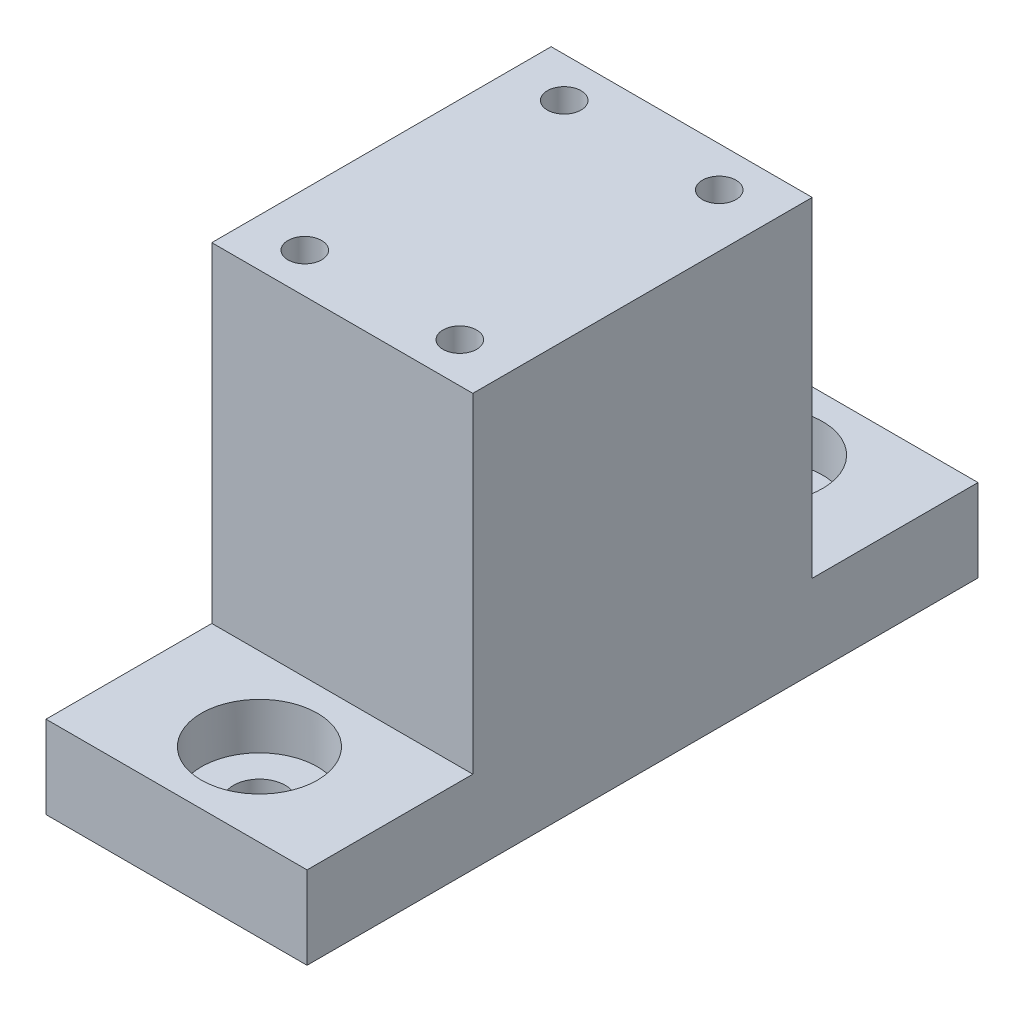
ISO-10303-21;
HEADER;
FILE_DESCRIPTION(('STEP AP214'),'2;1');
FILE_NAME('part.step','',(''),(''),'','','');
FILE_SCHEMA(('AUTOMOTIVE_DESIGN { 1 0 10303 214 1 1 1 1 }'));
ENDSEC;
DATA;
#1=APPLICATION_CONTEXT('core data for automotive mechanical design processes');
#2=APPLICATION_PROTOCOL_DEFINITION('international standard','automotive_design',2000,#1);
#3=PRODUCT_CONTEXT('',#1,'mechanical');
#4=PRODUCT('Part','Part','',(#3));
#5=PRODUCT_RELATED_PRODUCT_CATEGORY('part','',(#4));
#6=PRODUCT_DEFINITION_FORMATION('','',#4);
#7=PRODUCT_DEFINITION_CONTEXT('part definition',#1,'design');
#8=PRODUCT_DEFINITION('design','',#6,#7);
#9=PRODUCT_DEFINITION_SHAPE('','',#8);
#10=(LENGTH_UNIT() NAMED_UNIT(*) SI_UNIT(.MILLI.,.METRE.));
#11=(NAMED_UNIT(*) PLANE_ANGLE_UNIT() SI_UNIT($,.RADIAN.));
#12=(NAMED_UNIT(*) SI_UNIT($,.STERADIAN.) SOLID_ANGLE_UNIT());
#13=UNCERTAINTY_MEASURE_WITH_UNIT(LENGTH_MEASURE(1.E-05),#10,'distance_accuracy_value','');
#14=(GEOMETRIC_REPRESENTATION_CONTEXT(3) GLOBAL_UNCERTAINTY_ASSIGNED_CONTEXT((#13)) GLOBAL_UNIT_ASSIGNED_CONTEXT((#10,
#11,#12)) REPRESENTATION_CONTEXT('',''));
#15=CARTESIAN_POINT('',(0.,0.,0.));
#16=DIRECTION('',(0.,0.,1.));
#17=DIRECTION('',(1.,0.,0.));
#18=AXIS2_PLACEMENT_3D('',#15,#16,#17);
#19=CARTESIAN_POINT('',(19.99996,0.,38.7));
#20=DIRECTION('',(0.,1.,0.));
#21=DIRECTION('',(0.,0.,1.));
#22=AXIS2_PLACEMENT_3D('',#19,#20,#21);
#23=CYLINDRICAL_SURFACE('',#22,3.96875000000001);
#24=CARTESIAN_POINT('',(19.99996,0.,38.7));
#25=DIRECTION('',(0.,-1.,0.));
#26=DIRECTION('',(0.,0.,-1.));
#27=AXIS2_PLACEMENT_3D('',#24,#25,#26);
#28=CIRCLE('',#27,3.96875000000001);
#29=CARTESIAN_POINT('',(19.99996,0.,34.73125));
#30=VERTEX_POINT('',#29);
#31=EDGE_CURVE('E235',#30,#30,#28,.T.);
#32=ORIENTED_EDGE('',*,*,#31,.T.);
#33=EDGE_LOOP('',(#32));
#34=FACE_BOUND('',#33,.T.);
#35=CARTESIAN_POINT('',(19.99996,5.55751999999998,38.7));
#36=DIRECTION('',(0.,1.,0.));
#37=DIRECTION('',(0.,0.,1.));
#38=AXIS2_PLACEMENT_3D('',#35,#36,#37);
#39=CIRCLE('',#38,3.96875000000001);
#40=CARTESIAN_POINT('',(19.99996,5.55751999999998,42.66875));
#41=VERTEX_POINT('',#40);
#42=EDGE_CURVE('E241',#41,#41,#39,.F.);
#43=ORIENTED_EDGE('',*,*,#42,.F.);
#44=EDGE_LOOP('',(#43));
#45=FACE_BOUND('',#44,.T.);
#46=ADVANCED_FACE('F41',(#34,#45),#23,.F.);
#47=CARTESIAN_POINT('',(19.99996,0.,-38.7));
#48=DIRECTION('',(0.,1.,0.));
#49=DIRECTION('',(0.,0.,1.));
#50=AXIS2_PLACEMENT_3D('',#47,#48,#49);
#51=CYLINDRICAL_SURFACE('',#50,3.96875000000001);
#52=CARTESIAN_POINT('',(19.99996,0.,-38.7));
#53=DIRECTION('',(0.,1.,0.));
#54=DIRECTION('',(0.,0.,1.));
#55=AXIS2_PLACEMENT_3D('',#52,#53,#54);
#56=CIRCLE('',#55,3.96875000000001);
#57=CARTESIAN_POINT('',(19.99996,0.,-34.73125));
#58=VERTEX_POINT('',#57);
#59=EDGE_CURVE('E232',#58,#58,#56,.T.);
#60=ORIENTED_EDGE('',*,*,#59,.F.);
#61=EDGE_LOOP('',(#60));
#62=FACE_BOUND('',#61,.T.);
#63=CARTESIAN_POINT('',(19.99996,5.55751999999998,-38.7));
#64=DIRECTION('',(0.,1.,0.));
#65=DIRECTION('',(0.,0.,1.));
#66=AXIS2_PLACEMENT_3D('',#63,#64,#65);
#67=CIRCLE('',#66,3.96875000000001);
#68=CARTESIAN_POINT('',(19.99996,5.55751999999998,-34.73125));
#69=VERTEX_POINT('',#68);
#70=EDGE_CURVE('E238',#69,#69,#67,.F.);
#71=ORIENTED_EDGE('',*,*,#70,.F.);
#72=EDGE_LOOP('',(#71));
#73=FACE_BOUND('',#72,.T.);
#74=ADVANCED_FACE('F269',(#62,#73),#51,.F.);
#75=CARTESIAN_POINT('',(39.99992,0.,-51.4));
#76=DIRECTION('',(0.,1.,0.));
#77=DIRECTION('',(0.,0.,1.));
#78=AXIS2_PLACEMENT_3D('',#75,#76,#77);
#79=PLANE('',#78);
#80=CARTESIAN_POINT('',(31.87496,0.,-19.875));
#81=DIRECTION('',(0.,1.,0.));
#82=DIRECTION('',(0.,0.,1.));
#83=AXIS2_PLACEMENT_3D('',#80,#81,#82);
#84=CIRCLE('',#83,4.7625);
#85=CARTESIAN_POINT('',(31.87496,0.,-15.1125));
#86=VERTEX_POINT('',#85);
#87=EDGE_CURVE('E221',#86,#86,#84,.T.);
#88=ORIENTED_EDGE('',*,*,#87,.T.);
#89=EDGE_LOOP('',(#88));
#90=FACE_BOUND('',#89,.T.);
#91=CARTESIAN_POINT('',(31.87496,0.,19.875));
#92=DIRECTION('',(0.,1.,0.));
#93=DIRECTION('',(0.,0.,1.));
#94=AXIS2_PLACEMENT_3D('',#91,#92,#93);
#95=CIRCLE('',#94,4.7625);
#96=CARTESIAN_POINT('',(31.87496,0.,24.6375));
#97=VERTEX_POINT('',#96);
#98=EDGE_CURVE('E228',#97,#97,#95,.T.);
#99=ORIENTED_EDGE('',*,*,#98,.T.);
#100=EDGE_LOOP('',(#99));
#101=FACE_BOUND('',#100,.T.);
#102=DIRECTION('',(0.,0.,-1.));
#103=VECTOR('',#102,1.);
#104=CARTESIAN_POINT('',(0.,0.,-51.4));
#105=LINE('',#104,#103);
#106=CARTESIAN_POINT('',(0.,0.,51.4));
#107=VERTEX_POINT('',#106);
#108=CARTESIAN_POINT('',(0.,0.,-51.4));
#109=VERTEX_POINT('',#108);
#110=EDGE_CURVE('E142',#107,#109,#105,.T.);
#111=ORIENTED_EDGE('',*,*,#110,.T.);
#112=DIRECTION('',(-1.,0.,0.));
#113=VECTOR('',#112,1.);
#114=CARTESIAN_POINT('',(39.99992,0.,-51.4));
#115=LINE('',#114,#113);
#116=CARTESIAN_POINT('',(39.99992,0.,-51.4));
#117=VERTEX_POINT('',#116);
#118=EDGE_CURVE('E50',#117,#109,#115,.T.);
#119=ORIENTED_EDGE('',*,*,#118,.F.);
#120=DIRECTION('',(0.,0.,-1.));
#121=VECTOR('',#120,1.);
#122=CARTESIAN_POINT('',(39.99992,0.,-51.4));
#123=LINE('',#122,#121);
#124=CARTESIAN_POINT('',(39.99992,0.,51.4));
#125=VERTEX_POINT('',#124);
#126=EDGE_CURVE('E101',#125,#117,#123,.T.);
#127=ORIENTED_EDGE('',*,*,#126,.F.);
#128=DIRECTION('',(-1.,0.,0.));
#129=VECTOR('',#128,1.);
#130=CARTESIAN_POINT('',(39.99992,0.,51.4));
#131=LINE('',#130,#129);
#132=EDGE_CURVE('E12',#125,#107,#131,.T.);
#133=ORIENTED_EDGE('',*,*,#132,.T.);
#134=EDGE_LOOP('',(#111,#119,#127,#133));
#135=FACE_BOUND('',#134,.T.);
#136=CARTESIAN_POINT('',(8.12496,0.,-19.875));
#137=DIRECTION('',(0.,1.,0.));
#138=DIRECTION('',(0.,0.,1.));
#139=AXIS2_PLACEMENT_3D('',#136,#137,#138);
#140=CIRCLE('',#139,4.7625);
#141=CARTESIAN_POINT('',(8.12496,0.,-15.1125));
#142=VERTEX_POINT('',#141);
#143=EDGE_CURVE('E201',#142,#142,#140,.T.);
#144=ORIENTED_EDGE('',*,*,#143,.T.);
#145=EDGE_LOOP('',(#144));
#146=FACE_BOUND('',#145,.T.);
#147=CARTESIAN_POINT('',(8.12496,0.,19.875));
#148=DIRECTION('',(0.,1.,0.));
#149=DIRECTION('',(0.,0.,1.));
#150=AXIS2_PLACEMENT_3D('',#147,#148,#149);
#151=CIRCLE('',#150,4.7625);
#152=CARTESIAN_POINT('',(8.12496,0.,24.6375));
#153=VERTEX_POINT('',#152);
#154=EDGE_CURVE('E212',#153,#153,#151,.T.);
#155=ORIENTED_EDGE('',*,*,#154,.T.);
#156=EDGE_LOOP('',(#155));
#157=FACE_BOUND('',#156,.T.);
#158=ORIENTED_EDGE('',*,*,#31,.F.);
#159=EDGE_LOOP('',(#158));
#160=FACE_BOUND('',#159,.T.);
#161=ORIENTED_EDGE('',*,*,#59,.T.);
#162=EDGE_LOOP('',(#161));
#163=FACE_BOUND('',#162,.T.);
#164=ADVANCED_FACE('F271',(#90,#101,#135,#146,#157,#160,#163),#79,.F.);
#165=CARTESIAN_POINT('',(8.12496,0.,-19.875));
#166=DIRECTION('',(0.,1.,0.));
#167=DIRECTION('',(0.,0.,1.));
#168=AXIS2_PLACEMENT_3D('',#165,#166,#167);
#169=CYLINDRICAL_SURFACE('',#168,2.5796875);
#170=CARTESIAN_POINT('',(8.12496,63.1952,-19.875));
#171=DIRECTION('',(0.,1.,0.));
#172=DIRECTION('',(0.,0.,1.));
#173=AXIS2_PLACEMENT_3D('',#170,#171,#172);
#174=CIRCLE('',#173,2.5796875);
#175=CARTESIAN_POINT('',(8.12496,63.1952,-17.2953125));
#176=VERTEX_POINT('',#175);
#177=EDGE_CURVE('E143',#176,#176,#174,.T.);
#178=ORIENTED_EDGE('',*,*,#177,.T.);
#179=EDGE_LOOP('',(#178));
#180=FACE_BOUND('',#179,.T.);
#181=CARTESIAN_POINT('',(8.12496,56.8452,-19.875));
#182=DIRECTION('',(0.,-1.,0.));
#183=DIRECTION('',(0.,0.,-1.));
#184=AXIS2_PLACEMENT_3D('',#181,#182,#183);
#185=CIRCLE('',#184,2.5796875);
#186=CARTESIAN_POINT('',(8.12496,56.8452,-22.4546875));
#187=VERTEX_POINT('',#186);
#188=EDGE_CURVE('E198',#187,#187,#185,.T.);
#189=ORIENTED_EDGE('',*,*,#188,.T.);
#190=EDGE_LOOP('',(#189));
#191=FACE_BOUND('',#190,.T.);
#192=ADVANCED_FACE('F279',(#180,#191),#169,.F.);
#193=CARTESIAN_POINT('',(31.87496,0.,19.875));
#194=DIRECTION('',(0.,1.,0.));
#195=DIRECTION('',(0.,0.,1.));
#196=AXIS2_PLACEMENT_3D('',#193,#194,#195);
#197=CYLINDRICAL_SURFACE('',#196,2.5796875);
#198=CARTESIAN_POINT('',(31.87496,63.1952,19.875));
#199=DIRECTION('',(0.,1.,0.));
#200=DIRECTION('',(0.,0.,1.));
#201=AXIS2_PLACEMENT_3D('',#198,#199,#200);
#202=CIRCLE('',#201,2.5796875);
#203=CARTESIAN_POINT('',(31.87496,63.1952,22.4546875));
#204=VERTEX_POINT('',#203);
#205=EDGE_CURVE('E193',#204,#204,#202,.T.);
#206=ORIENTED_EDGE('',*,*,#205,.T.);
#207=EDGE_LOOP('',(#206));
#208=FACE_BOUND('',#207,.T.);
#209=CARTESIAN_POINT('',(31.87496,56.8452,19.875));
#210=DIRECTION('',(0.,-1.,0.));
#211=DIRECTION('',(0.,0.,-1.));
#212=AXIS2_PLACEMENT_3D('',#209,#210,#211);
#213=CIRCLE('',#212,2.5796875);
#214=CARTESIAN_POINT('',(31.87496,56.8452,17.2953125));
#215=VERTEX_POINT('',#214);
#216=EDGE_CURVE('E216',#215,#215,#213,.T.);
#217=ORIENTED_EDGE('',*,*,#216,.T.);
#218=EDGE_LOOP('',(#217));
#219=FACE_BOUND('',#218,.T.);
#220=ADVANCED_FACE('F319',(#208,#219),#197,.F.);
#221=CARTESIAN_POINT('',(8.12496,0.,19.875));
#222=DIRECTION('',(0.,1.,0.));
#223=DIRECTION('',(0.,0.,1.));
#224=AXIS2_PLACEMENT_3D('',#221,#222,#223);
#225=CYLINDRICAL_SURFACE('',#224,2.5796875);
#226=CARTESIAN_POINT('',(8.12496,63.1952,19.875));
#227=DIRECTION('',(0.,1.,0.));
#228=DIRECTION('',(0.,0.,1.));
#229=AXIS2_PLACEMENT_3D('',#226,#227,#228);
#230=CIRCLE('',#229,2.5796875);
#231=CARTESIAN_POINT('',(8.12496,63.1952,22.4546875));
#232=VERTEX_POINT('',#231);
#233=EDGE_CURVE('E190',#232,#232,#230,.F.);
#234=ORIENTED_EDGE('',*,*,#233,.F.);
#235=EDGE_LOOP('',(#234));
#236=FACE_BOUND('',#235,.T.);
#237=CARTESIAN_POINT('',(8.12496,56.8452,19.875));
#238=DIRECTION('',(0.,-1.,0.));
#239=DIRECTION('',(0.,0.,-1.));
#240=AXIS2_PLACEMENT_3D('',#237,#238,#239);
#241=CIRCLE('',#240,2.5796875);
#242=CARTESIAN_POINT('',(8.12496,56.8452,17.2953125));
#243=VERTEX_POINT('',#242);
#244=EDGE_CURVE('E208',#243,#243,#241,.T.);
#245=ORIENTED_EDGE('',*,*,#244,.T.);
#246=EDGE_LOOP('',(#245));
#247=FACE_BOUND('',#246,.T.);
#248=ADVANCED_FACE('F322',(#236,#247),#225,.F.);
#249=CARTESIAN_POINT('',(31.87496,0.,-19.875));
#250=DIRECTION('',(0.,1.,0.));
#251=DIRECTION('',(0.,0.,1.));
#252=AXIS2_PLACEMENT_3D('',#249,#250,#251);
#253=CYLINDRICAL_SURFACE('',#252,2.5796875);
#254=CARTESIAN_POINT('',(31.87496,63.1952,-19.875));
#255=DIRECTION('',(0.,1.,0.));
#256=DIRECTION('',(0.,0.,1.));
#257=AXIS2_PLACEMENT_3D('',#254,#255,#256);
#258=CIRCLE('',#257,2.5796875);
#259=CARTESIAN_POINT('',(31.87496,63.1952,-17.2953125));
#260=VERTEX_POINT('',#259);
#261=EDGE_CURVE('E189',#260,#260,#258,.F.);
#262=ORIENTED_EDGE('',*,*,#261,.F.);
#263=EDGE_LOOP('',(#262));
#264=FACE_BOUND('',#263,.T.);
#265=CARTESIAN_POINT('',(31.87496,56.8452,-19.875));
#266=DIRECTION('',(0.,-1.,0.));
#267=DIRECTION('',(0.,0.,-1.));
#268=AXIS2_PLACEMENT_3D('',#265,#266,#267);
#269=CIRCLE('',#268,2.5796875);
#270=CARTESIAN_POINT('',(31.87496,56.8452,-22.4546875));
#271=VERTEX_POINT('',#270);
#272=EDGE_CURVE('E205',#271,#271,#269,.T.);
#273=ORIENTED_EDGE('',*,*,#272,.T.);
#274=EDGE_LOOP('',(#273));
#275=FACE_BOUND('',#274,.T.);
#276=ADVANCED_FACE('F324',(#264,#275),#253,.F.);
#277=CARTESIAN_POINT('',(39.99992,63.1952,-26.));
#278=DIRECTION('',(0.,-1.,0.));
#279=DIRECTION('',(0.,0.,-1.));
#280=AXIS2_PLACEMENT_3D('',#277,#278,#279);
#281=PLANE('',#280);
#282=ORIENTED_EDGE('',*,*,#205,.F.);
#283=EDGE_LOOP('',(#282));
#284=FACE_BOUND('',#283,.T.);
#285=ORIENTED_EDGE('',*,*,#177,.F.);
#286=EDGE_LOOP('',(#285));
#287=FACE_BOUND('',#286,.T.);
#288=DIRECTION('',(0.,0.,1.));
#289=VECTOR('',#288,1.);
#290=CARTESIAN_POINT('',(0.,63.1952,-26.));
#291=LINE('',#290,#289);
#292=CARTESIAN_POINT('',(0.,63.1952,-26.));
#293=VERTEX_POINT('',#292);
#294=CARTESIAN_POINT('',(0.,63.1952,26.));
#295=VERTEX_POINT('',#294);
#296=EDGE_CURVE('E129',#293,#295,#291,.T.);
#297=ORIENTED_EDGE('',*,*,#296,.T.);
#298=DIRECTION('',(-1.,0.,0.));
#299=VECTOR('',#298,1.);
#300=CARTESIAN_POINT('',(39.99992,63.1952,26.));
#301=LINE('',#300,#299);
#302=CARTESIAN_POINT('',(39.99992,63.1952,26.));
#303=VERTEX_POINT('',#302);
#304=EDGE_CURVE('E125',#303,#295,#301,.T.);
#305=ORIENTED_EDGE('',*,*,#304,.F.);
#306=DIRECTION('',(0.,0.,1.));
#307=VECTOR('',#306,1.);
#308=CARTESIAN_POINT('',(39.99992,63.1952,-26.));
#309=LINE('',#308,#307);
#310=CARTESIAN_POINT('',(39.99992,63.1952,-26.));
#311=VERTEX_POINT('',#310);
#312=EDGE_CURVE('E114',#311,#303,#309,.T.);
#313=ORIENTED_EDGE('',*,*,#312,.F.);
#314=DIRECTION('',(-1.,0.,0.));
#315=VECTOR('',#314,1.);
#316=CARTESIAN_POINT('',(39.99992,63.1952,-26.));
#317=LINE('',#316,#315);
#318=EDGE_CURVE('E130',#311,#293,#317,.T.);
#319=ORIENTED_EDGE('',*,*,#318,.T.);
#320=EDGE_LOOP('',(#297,#305,#313,#319));
#321=FACE_BOUND('',#320,.T.);
#322=ORIENTED_EDGE('',*,*,#233,.T.);
#323=EDGE_LOOP('',(#322));
#324=FACE_BOUND('',#323,.T.);
#325=ORIENTED_EDGE('',*,*,#261,.T.);
#326=EDGE_LOOP('',(#325));
#327=FACE_BOUND('',#326,.T.);
#328=ADVANCED_FACE('F126',(#284,#287,#321,#324,#327),#281,.F.);
#329=CARTESIAN_POINT('',(39.99992,0.,51.4));
#330=DIRECTION('',(0.,0.,-1.));
#331=DIRECTION('',(-1.,0.,0.));
#332=AXIS2_PLACEMENT_3D('',#329,#330,#331);
#333=PLANE('',#332);
#334=DIRECTION('',(0.,-1.,0.));
#335=VECTOR('',#334,1.);
#336=CARTESIAN_POINT('',(0.,0.,51.4));
#337=LINE('',#336,#335);
#338=CARTESIAN_POINT('',(0.,12.6619,51.4));
#339=VERTEX_POINT('',#338);
#340=EDGE_CURVE('E139',#339,#107,#337,.T.);
#341=ORIENTED_EDGE('',*,*,#340,.T.);
#342=ORIENTED_EDGE('',*,*,#132,.F.);
#343=DIRECTION('',(0.,-1.,0.));
#344=VECTOR('',#343,1.);
#345=CARTESIAN_POINT('',(39.99992,0.,51.4));
#346=LINE('',#345,#344);
#347=CARTESIAN_POINT('',(39.99992,12.6619,51.4));
#348=VERTEX_POINT('',#347);
#349=EDGE_CURVE('E154',#348,#125,#346,.T.);
#350=ORIENTED_EDGE('',*,*,#349,.F.);
#351=DIRECTION('',(-1.,0.,0.));
#352=VECTOR('',#351,1.);
#353=CARTESIAN_POINT('',(39.99992,12.6619,51.4));
#354=LINE('',#353,#352);
#355=EDGE_CURVE('E135',#348,#339,#354,.T.);
#356=ORIENTED_EDGE('',*,*,#355,.T.);
#357=EDGE_LOOP('',(#341,#342,#350,#356));
#358=FACE_BOUND('',#357,.T.);
#359=ADVANCED_FACE('F43',(#358),#333,.F.);
#360=CARTESIAN_POINT('',(39.99992,0.,-51.4));
#361=DIRECTION('',(0.,0.,1.));
#362=DIRECTION('',(1.,0.,0.));
#363=AXIS2_PLACEMENT_3D('',#360,#361,#362);
#364=PLANE('',#363);
#365=DIRECTION('',(0.,1.,0.));
#366=VECTOR('',#365,1.);
#367=CARTESIAN_POINT('',(0.,0.,-51.4));
#368=LINE('',#367,#366);
#369=CARTESIAN_POINT('',(0.,12.6619,-51.4));
#370=VERTEX_POINT('',#369);
#371=EDGE_CURVE('E145',#109,#370,#368,.T.);
#372=ORIENTED_EDGE('',*,*,#371,.T.);
#373=DIRECTION('',(-1.,0.,0.));
#374=VECTOR('',#373,1.);
#375=CARTESIAN_POINT('',(39.99992,12.6619,-51.4));
#376=LINE('',#375,#374);
#377=CARTESIAN_POINT('',(39.99992,12.6619,-51.4));
#378=VERTEX_POINT('',#377);
#379=EDGE_CURVE('E161',#378,#370,#376,.T.);
#380=ORIENTED_EDGE('',*,*,#379,.F.);
#381=DIRECTION('',(0.,1.,0.));
#382=VECTOR('',#381,1.);
#383=CARTESIAN_POINT('',(39.99992,0.,-51.4));
#384=LINE('',#383,#382);
#385=EDGE_CURVE('E169',#117,#378,#384,.T.);
#386=ORIENTED_EDGE('',*,*,#385,.F.);
#387=ORIENTED_EDGE('',*,*,#118,.T.);
#388=EDGE_LOOP('',(#372,#380,#386,#387));
#389=FACE_BOUND('',#388,.T.);
#390=ADVANCED_FACE('F167',(#389),#364,.F.);
#391=CARTESIAN_POINT('',(39.99992,12.6619,-51.4));
#392=DIRECTION('',(0.,-1.,0.));
#393=DIRECTION('',(0.,0.,-1.));
#394=AXIS2_PLACEMENT_3D('',#391,#392,#393);
#395=PLANE('',#394);
#396=CARTESIAN_POINT('',(19.99996,12.6619,-38.7));
#397=DIRECTION('',(0.,1.,0.));
#398=DIRECTION('',(0.,0.,1.));
#399=AXIS2_PLACEMENT_3D('',#396,#397,#398);
#400=CIRCLE('',#399,8.89);
#401=CARTESIAN_POINT('',(19.99996,12.6619,-29.81));
#402=VERTEX_POINT('',#401);
#403=EDGE_CURVE('E244',#402,#402,#400,.T.);
#404=ORIENTED_EDGE('',*,*,#403,.F.);
#405=EDGE_LOOP('',(#404));
#406=FACE_BOUND('',#405,.T.);
#407=DIRECTION('',(0.,0.,1.));
#408=VECTOR('',#407,1.);
#409=CARTESIAN_POINT('',(0.,12.6619,-51.4));
#410=LINE('',#409,#408);
#411=CARTESIAN_POINT('',(0.,12.6619,-26.));
#412=VERTEX_POINT('',#411);
#413=EDGE_CURVE('E147',#370,#412,#410,.T.);
#414=ORIENTED_EDGE('',*,*,#413,.T.);
#415=DIRECTION('',(-1.,0.,0.));
#416=VECTOR('',#415,1.);
#417=CARTESIAN_POINT('',(39.99992,12.6619,-26.));
#418=LINE('',#417,#416);
#419=CARTESIAN_POINT('',(39.99992,12.6619,-26.));
#420=VERTEX_POINT('',#419);
#421=EDGE_CURVE('E158',#420,#412,#418,.T.);
#422=ORIENTED_EDGE('',*,*,#421,.F.);
#423=DIRECTION('',(0.,0.,1.));
#424=VECTOR('',#423,1.);
#425=CARTESIAN_POINT('',(39.99992,12.6619,-51.4));
#426=LINE('',#425,#424);
#427=EDGE_CURVE('E181',#378,#420,#426,.T.);
#428=ORIENTED_EDGE('',*,*,#427,.F.);
#429=ORIENTED_EDGE('',*,*,#379,.T.);
#430=EDGE_LOOP('',(#414,#422,#428,#429));
#431=FACE_BOUND('',#430,.T.);
#432=ADVANCED_FACE('F177',(#406,#431),#395,.F.);
#433=CARTESIAN_POINT('',(39.99992,12.6619,-26.));
#434=DIRECTION('',(0.,0.,1.));
#435=DIRECTION('',(1.,0.,0.));
#436=AXIS2_PLACEMENT_3D('',#433,#434,#435);
#437=PLANE('',#436);
#438=DIRECTION('',(0.,1.,0.));
#439=VECTOR('',#438,1.);
#440=CARTESIAN_POINT('',(0.,12.6619,-26.));
#441=LINE('',#440,#439);
#442=EDGE_CURVE('E149',#412,#293,#441,.T.);
#443=ORIENTED_EDGE('',*,*,#442,.T.);
#444=ORIENTED_EDGE('',*,*,#318,.F.);
#445=DIRECTION('',(0.,1.,0.));
#446=VECTOR('',#445,1.);
#447=CARTESIAN_POINT('',(39.99992,12.6619,-26.));
#448=LINE('',#447,#446);
#449=EDGE_CURVE('E120',#420,#311,#448,.T.);
#450=ORIENTED_EDGE('',*,*,#449,.F.);
#451=ORIENTED_EDGE('',*,*,#421,.T.);
#452=EDGE_LOOP('',(#443,#444,#450,#451));
#453=FACE_BOUND('',#452,.T.);
#454=ADVANCED_FACE('F180',(#453),#437,.F.);
#455=CARTESIAN_POINT('',(39.99992,12.6619,26.));
#456=DIRECTION('',(0.,0.,-1.));
#457=DIRECTION('',(-1.,0.,0.));
#458=AXIS2_PLACEMENT_3D('',#455,#456,#457);
#459=PLANE('',#458);
#460=DIRECTION('',(0.,-1.,0.));
#461=VECTOR('',#460,1.);
#462=CARTESIAN_POINT('',(0.,12.6619,26.));
#463=LINE('',#462,#461);
#464=CARTESIAN_POINT('',(0.,12.6619,26.));
#465=VERTEX_POINT('',#464);
#466=EDGE_CURVE('E87',#295,#465,#463,.T.);
#467=ORIENTED_EDGE('',*,*,#466,.T.);
#468=DIRECTION('',(-1.,0.,0.));
#469=VECTOR('',#468,1.);
#470=CARTESIAN_POINT('',(39.99992,12.6619,26.));
#471=LINE('',#470,#469);
#472=CARTESIAN_POINT('',(39.99992,12.6619,26.));
#473=VERTEX_POINT('',#472);
#474=EDGE_CURVE('E131',#473,#465,#471,.T.);
#475=ORIENTED_EDGE('',*,*,#474,.F.);
#476=DIRECTION('',(0.,-1.,0.));
#477=VECTOR('',#476,1.);
#478=CARTESIAN_POINT('',(39.99992,12.6619,26.));
#479=LINE('',#478,#477);
#480=EDGE_CURVE('E118',#303,#473,#479,.T.);
#481=ORIENTED_EDGE('',*,*,#480,.F.);
#482=ORIENTED_EDGE('',*,*,#304,.T.);
#483=EDGE_LOOP('',(#467,#475,#481,#482));
#484=FACE_BOUND('',#483,.T.);
#485=ADVANCED_FACE('F133',(#484),#459,.F.);
#486=CARTESIAN_POINT('',(39.99992,12.6619,51.4));
#487=DIRECTION('',(0.,-1.,0.));
#488=DIRECTION('',(0.,0.,-1.));
#489=AXIS2_PLACEMENT_3D('',#486,#487,#488);
#490=PLANE('',#489);
#491=CARTESIAN_POINT('',(19.99996,12.6619,38.7));
#492=DIRECTION('',(0.,1.,0.));
#493=DIRECTION('',(0.,0.,-1.));
#494=AXIS2_PLACEMENT_3D('',#491,#492,#493);
#495=CIRCLE('',#494,8.89);
#496=CARTESIAN_POINT('',(19.99996,12.6619,29.81));
#497=VERTEX_POINT('',#496);
#498=EDGE_CURVE('E246',#497,#497,#495,.T.);
#499=ORIENTED_EDGE('',*,*,#498,.F.);
#500=EDGE_LOOP('',(#499));
#501=FACE_BOUND('',#500,.T.);
#502=DIRECTION('',(0.,0.,1.));
#503=VECTOR('',#502,1.);
#504=CARTESIAN_POINT('',(0.,12.6619,51.4));
#505=LINE('',#504,#503);
#506=EDGE_CURVE('E93',#465,#339,#505,.T.);
#507=ORIENTED_EDGE('',*,*,#506,.T.);
#508=ORIENTED_EDGE('',*,*,#355,.F.);
#509=DIRECTION('',(0.,0.,1.));
#510=VECTOR('',#509,1.);
#511=CARTESIAN_POINT('',(39.99992,12.6619,51.4));
#512=LINE('',#511,#510);
#513=EDGE_CURVE('E58',#473,#348,#512,.T.);
#514=ORIENTED_EDGE('',*,*,#513,.F.);
#515=ORIENTED_EDGE('',*,*,#474,.T.);
#516=EDGE_LOOP('',(#507,#508,#514,#515));
#517=FACE_BOUND('',#516,.T.);
#518=ADVANCED_FACE('F336',(#501,#517),#490,.F.);
#519=CARTESIAN_POINT('',(39.99992,0.,0.));
#520=DIRECTION('',(-1.,0.,0.));
#521=DIRECTION('',(0.,0.,1.));
#522=AXIS2_PLACEMENT_3D('',#519,#520,#521);
#523=PLANE('',#522);
#524=ORIENTED_EDGE('',*,*,#349,.T.);
#525=ORIENTED_EDGE('',*,*,#126,.T.);
#526=ORIENTED_EDGE('',*,*,#385,.T.);
#527=ORIENTED_EDGE('',*,*,#427,.T.);
#528=ORIENTED_EDGE('',*,*,#449,.T.);
#529=ORIENTED_EDGE('',*,*,#312,.T.);
#530=ORIENTED_EDGE('',*,*,#480,.T.);
#531=ORIENTED_EDGE('',*,*,#513,.T.);
#532=EDGE_LOOP('',(#524,#525,#526,#527,#528,#529,#530,#531));
#533=FACE_BOUND('',#532,.T.);
#534=ADVANCED_FACE('F116',(#533),#523,.F.);
#535=CARTESIAN_POINT('',(0.,0.,0.));
#536=DIRECTION('',(-1.,0.,0.));
#537=DIRECTION('',(0.,0.,1.));
#538=AXIS2_PLACEMENT_3D('',#535,#536,#537);
#539=PLANE('',#538);
#540=ORIENTED_EDGE('',*,*,#340,.F.);
#541=ORIENTED_EDGE('',*,*,#506,.F.);
#542=ORIENTED_EDGE('',*,*,#466,.F.);
#543=ORIENTED_EDGE('',*,*,#296,.F.);
#544=ORIENTED_EDGE('',*,*,#442,.F.);
#545=ORIENTED_EDGE('',*,*,#413,.F.);
#546=ORIENTED_EDGE('',*,*,#371,.F.);
#547=ORIENTED_EDGE('',*,*,#110,.F.);
#548=EDGE_LOOP('',(#540,#541,#542,#543,#544,#545,#546,#547));
#549=FACE_BOUND('',#548,.T.);
#550=ADVANCED_FACE('F173',(#549),#539,.T.);
#551=CARTESIAN_POINT('',(31.87496,76.6655841816037,-19.875));
#552=DIRECTION('',(0.,-1.,0.));
#553=DIRECTION('',(0.,0.,-1.));
#554=AXIS2_PLACEMENT_3D('',#551,#552,#553);
#555=CYLINDRICAL_SURFACE('',#554,4.7625);
#556=CARTESIAN_POINT('',(31.87496,56.8452,-19.875));
#557=DIRECTION('',(0.,-1.,0.));
#558=DIRECTION('',(0.,0.,-1.));
#559=AXIS2_PLACEMENT_3D('',#556,#557,#558);
#560=CIRCLE('',#559,4.7625);
#561=CARTESIAN_POINT('',(31.87496,56.8452,-24.6375));
#562=VERTEX_POINT('',#561);
#563=EDGE_CURVE('E211',#562,#562,#560,.T.);
#564=ORIENTED_EDGE('',*,*,#563,.F.);
#565=EDGE_LOOP('',(#564));
#566=FACE_BOUND('',#565,.T.);
#567=ORIENTED_EDGE('',*,*,#87,.F.);
#568=EDGE_LOOP('',(#567));
#569=FACE_BOUND('',#568,.T.);
#570=ADVANCED_FACE('F297',(#566,#569),#555,.F.);
#571=CARTESIAN_POINT('',(39.99992,56.8452,-26.));
#572=DIRECTION('',(0.,-1.,0.));
#573=DIRECTION('',(0.,0.,-1.));
#574=AXIS2_PLACEMENT_3D('',#571,#572,#573);
#575=PLANE('',#574);
#576=ORIENTED_EDGE('',*,*,#272,.F.);
#577=EDGE_LOOP('',(#576));
#578=FACE_BOUND('',#577,.T.);
#579=ORIENTED_EDGE('',*,*,#563,.T.);
#580=EDGE_LOOP('',(#579));
#581=FACE_BOUND('',#580,.T.);
#582=ADVANCED_FACE('F300',(#578,#581),#575,.T.);
#583=CARTESIAN_POINT('',(8.12496,76.6655841816037,19.875));
#584=DIRECTION('',(0.,-1.,0.));
#585=DIRECTION('',(0.,0.,-1.));
#586=AXIS2_PLACEMENT_3D('',#583,#584,#585);
#587=CYLINDRICAL_SURFACE('',#586,4.7625);
#588=CARTESIAN_POINT('',(8.12496,56.8452,19.875));
#589=DIRECTION('',(0.,-1.,0.));
#590=DIRECTION('',(0.,0.,-1.));
#591=AXIS2_PLACEMENT_3D('',#588,#589,#590);
#592=CIRCLE('',#591,4.7625);
#593=CARTESIAN_POINT('',(8.12496,56.8452,15.1125));
#594=VERTEX_POINT('',#593);
#595=EDGE_CURVE('E213',#594,#594,#592,.T.);
#596=ORIENTED_EDGE('',*,*,#595,.F.);
#597=EDGE_LOOP('',(#596));
#598=FACE_BOUND('',#597,.T.);
#599=ORIENTED_EDGE('',*,*,#154,.F.);
#600=EDGE_LOOP('',(#599));
#601=FACE_BOUND('',#600,.T.);
#602=ADVANCED_FACE('F304',(#598,#601),#587,.F.);
#603=CARTESIAN_POINT('',(39.99992,56.8452,-26.));
#604=DIRECTION('',(0.,-1.,0.));
#605=DIRECTION('',(0.,0.,-1.));
#606=AXIS2_PLACEMENT_3D('',#603,#604,#605);
#607=PLANE('',#606);
#608=ORIENTED_EDGE('',*,*,#244,.F.);
#609=EDGE_LOOP('',(#608));
#610=FACE_BOUND('',#609,.T.);
#611=ORIENTED_EDGE('',*,*,#595,.T.);
#612=EDGE_LOOP('',(#611));
#613=FACE_BOUND('',#612,.T.);
#614=ADVANCED_FACE('F291',(#610,#613),#607,.T.);
#615=CARTESIAN_POINT('',(31.87496,76.6655841816037,19.875));
#616=DIRECTION('',(0.,-1.,0.));
#617=DIRECTION('',(0.,0.,-1.));
#618=AXIS2_PLACEMENT_3D('',#615,#616,#617);
#619=CYLINDRICAL_SURFACE('',#618,4.7625);
#620=CARTESIAN_POINT('',(31.87496,56.8452,19.875));
#621=DIRECTION('',(0.,-1.,0.));
#622=DIRECTION('',(0.,0.,-1.));
#623=AXIS2_PLACEMENT_3D('',#620,#621,#622);
#624=CIRCLE('',#623,4.7625);
#625=CARTESIAN_POINT('',(31.87496,56.8452,15.1125));
#626=VERTEX_POINT('',#625);
#627=EDGE_CURVE('E229',#626,#626,#624,.T.);
#628=ORIENTED_EDGE('',*,*,#627,.F.);
#629=EDGE_LOOP('',(#628));
#630=FACE_BOUND('',#629,.T.);
#631=ORIENTED_EDGE('',*,*,#98,.F.);
#632=EDGE_LOOP('',(#631));
#633=FACE_BOUND('',#632,.T.);
#634=ADVANCED_FACE('F287',(#630,#633),#619,.F.);
#635=CARTESIAN_POINT('',(39.99992,56.8452,-26.));
#636=DIRECTION('',(0.,-1.,0.));
#637=DIRECTION('',(0.,0.,-1.));
#638=AXIS2_PLACEMENT_3D('',#635,#636,#637);
#639=PLANE('',#638);
#640=ORIENTED_EDGE('',*,*,#216,.F.);
#641=EDGE_LOOP('',(#640));
#642=FACE_BOUND('',#641,.T.);
#643=ORIENTED_EDGE('',*,*,#627,.T.);
#644=EDGE_LOOP('',(#643));
#645=FACE_BOUND('',#644,.T.);
#646=ADVANCED_FACE('F290',(#642,#645),#639,.T.);
#647=CARTESIAN_POINT('',(8.12496,76.6655841816037,-19.875));
#648=DIRECTION('',(0.,-1.,0.));
#649=DIRECTION('',(0.,0.,-1.));
#650=AXIS2_PLACEMENT_3D('',#647,#648,#649);
#651=CYLINDRICAL_SURFACE('',#650,4.7625);
#652=CARTESIAN_POINT('',(8.12496,56.8452,-19.875));
#653=DIRECTION('',(0.,-1.,0.));
#654=DIRECTION('',(0.,0.,-1.));
#655=AXIS2_PLACEMENT_3D('',#652,#653,#654);
#656=CIRCLE('',#655,4.7625);
#657=CARTESIAN_POINT('',(8.12496,56.8452,-24.6375));
#658=VERTEX_POINT('',#657);
#659=EDGE_CURVE('E202',#658,#658,#656,.T.);
#660=ORIENTED_EDGE('',*,*,#659,.F.);
#661=EDGE_LOOP('',(#660));
#662=FACE_BOUND('',#661,.T.);
#663=ORIENTED_EDGE('',*,*,#143,.F.);
#664=EDGE_LOOP('',(#663));
#665=FACE_BOUND('',#664,.T.);
#666=ADVANCED_FACE('F295',(#662,#665),#651,.F.);
#667=CARTESIAN_POINT('',(39.99992,56.8452,-26.));
#668=DIRECTION('',(0.,-1.,0.));
#669=DIRECTION('',(0.,0.,-1.));
#670=AXIS2_PLACEMENT_3D('',#667,#668,#669);
#671=PLANE('',#670);
#672=ORIENTED_EDGE('',*,*,#188,.F.);
#673=EDGE_LOOP('',(#672));
#674=FACE_BOUND('',#673,.T.);
#675=ORIENTED_EDGE('',*,*,#659,.T.);
#676=EDGE_LOOP('',(#675));
#677=FACE_BOUND('',#676,.T.);
#678=ADVANCED_FACE('F314',(#674,#677),#671,.T.);
#679=CARTESIAN_POINT('',(19.99996,-25.1447171389936,-38.7));
#680=DIRECTION('',(0.,1.,0.));
#681=DIRECTION('',(0.,0.,1.));
#682=AXIS2_PLACEMENT_3D('',#679,#680,#681);
#683=CYLINDRICAL_SURFACE('',#682,8.89);
#684=CARTESIAN_POINT('',(19.99996,5.55751999999998,-38.7));
#685=DIRECTION('',(0.,1.,0.));
#686=DIRECTION('',(0.,0.,1.));
#687=AXIS2_PLACEMENT_3D('',#684,#685,#686);
#688=CIRCLE('',#687,8.89);
#689=CARTESIAN_POINT('',(19.99996,5.55751999999998,-29.81));
#690=VERTEX_POINT('',#689);
#691=EDGE_CURVE('E253',#690,#690,#688,.F.);
#692=ORIENTED_EDGE('',*,*,#691,.T.);
#693=EDGE_LOOP('',(#692));
#694=FACE_BOUND('',#693,.T.);
#695=ORIENTED_EDGE('',*,*,#403,.T.);
#696=EDGE_LOOP('',(#695));
#697=FACE_BOUND('',#696,.T.);
#698=ADVANCED_FACE('F259',(#694,#697),#683,.F.);
#699=CARTESIAN_POINT('',(39.99992,5.55751999999998,-51.4));
#700=DIRECTION('',(0.,1.,0.));
#701=DIRECTION('',(0.,0.,1.));
#702=AXIS2_PLACEMENT_3D('',#699,#700,#701);
#703=PLANE('',#702);
#704=ORIENTED_EDGE('',*,*,#691,.F.);
#705=EDGE_LOOP('',(#704));
#706=FACE_BOUND('',#705,.T.);
#707=ORIENTED_EDGE('',*,*,#70,.T.);
#708=EDGE_LOOP('',(#707));
#709=FACE_BOUND('',#708,.T.);
#710=ADVANCED_FACE('F262',(#706,#709),#703,.T.);
#711=CARTESIAN_POINT('',(19.99996,-25.1447171389937,38.7));
#712=DIRECTION('',(0.,1.,0.));
#713=DIRECTION('',(0.,0.,1.));
#714=AXIS2_PLACEMENT_3D('',#711,#712,#713);
#715=CYLINDRICAL_SURFACE('',#714,8.89);
#716=CARTESIAN_POINT('',(19.99996,5.55751999999998,38.7));
#717=DIRECTION('',(0.,1.,0.));
#718=DIRECTION('',(0.,0.,1.));
#719=AXIS2_PLACEMENT_3D('',#716,#717,#718);
#720=CIRCLE('',#719,8.89);
#721=CARTESIAN_POINT('',(19.99996,5.55751999999998,47.59));
#722=VERTEX_POINT('',#721);
#723=EDGE_CURVE('E245',#722,#722,#720,.F.);
#724=ORIENTED_EDGE('',*,*,#723,.T.);
#725=EDGE_LOOP('',(#724));
#726=FACE_BOUND('',#725,.T.);
#727=ORIENTED_EDGE('',*,*,#498,.T.);
#728=EDGE_LOOP('',(#727));
#729=FACE_BOUND('',#728,.T.);
#730=ADVANCED_FACE('F265',(#726,#729),#715,.F.);
#731=CARTESIAN_POINT('',(39.99992,5.55751999999998,-51.4));
#732=DIRECTION('',(0.,1.,0.));
#733=DIRECTION('',(0.,0.,1.));
#734=AXIS2_PLACEMENT_3D('',#731,#732,#733);
#735=PLANE('',#734);
#736=ORIENTED_EDGE('',*,*,#723,.F.);
#737=EDGE_LOOP('',(#736));
#738=FACE_BOUND('',#737,.T.);
#739=ORIENTED_EDGE('',*,*,#42,.T.);
#740=EDGE_LOOP('',(#739));
#741=FACE_BOUND('',#740,.T.);
#742=ADVANCED_FACE('F370',(#738,#741),#735,.T.);
#743=CLOSED_SHELL('',(#46,#74,#164,#192,#220,#248,#276,#328,#359,#390,#432,#454,#485,#518,#534,
#550,#570,#582,#602,#614,#634,#646,#666,#678,#698,#710,#730,#742));
#744=MANIFOLD_SOLID_BREP('B2',#743);
#745=ADVANCED_BREP_SHAPE_REPRESENTATION('',(#18,#744),#14);
#746=SHAPE_DEFINITION_REPRESENTATION(#9,#745);
ENDSEC;
END-ISO-10303-21;
